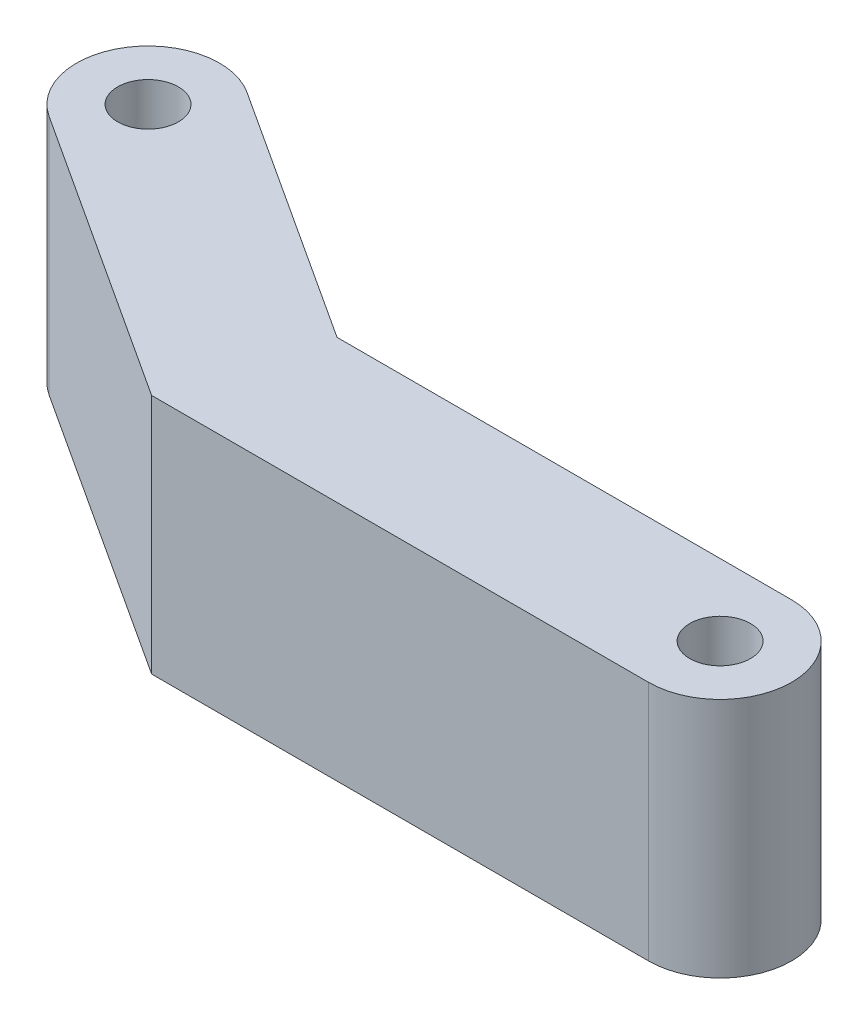
ISO-10303-21;
HEADER;
FILE_DESCRIPTION(('STEP AP214'),'2;1');
FILE_NAME('part.step','',(''),(''),'','','');
FILE_SCHEMA(('AUTOMOTIVE_DESIGN { 1 0 10303 214 1 1 1 1 }'));
ENDSEC;
DATA;
#1=APPLICATION_CONTEXT('core data for automotive mechanical design processes');
#2=APPLICATION_PROTOCOL_DEFINITION('international standard','automotive_design',2000,#1);
#3=PRODUCT_CONTEXT('',#1,'mechanical');
#4=PRODUCT('Part','Part','',(#3));
#5=PRODUCT_RELATED_PRODUCT_CATEGORY('part','',(#4));
#6=PRODUCT_DEFINITION_FORMATION('','',#4);
#7=PRODUCT_DEFINITION_CONTEXT('part definition',#1,'design');
#8=PRODUCT_DEFINITION('design','',#6,#7);
#9=PRODUCT_DEFINITION_SHAPE('','',#8);
#10=(LENGTH_UNIT() NAMED_UNIT(*) SI_UNIT(.MILLI.,.METRE.));
#11=(NAMED_UNIT(*) PLANE_ANGLE_UNIT() SI_UNIT($,.RADIAN.));
#12=(NAMED_UNIT(*) SI_UNIT($,.STERADIAN.) SOLID_ANGLE_UNIT());
#13=UNCERTAINTY_MEASURE_WITH_UNIT(LENGTH_MEASURE(1.E-05),#10,'distance_accuracy_value','');
#14=(GEOMETRIC_REPRESENTATION_CONTEXT(3) GLOBAL_UNCERTAINTY_ASSIGNED_CONTEXT((#13)) GLOBAL_UNIT_ASSIGNED_CONTEXT((#10,
#11,#12)) REPRESENTATION_CONTEXT('',''));
#15=CARTESIAN_POINT('',(0.,0.,0.));
#16=DIRECTION('',(0.,0.,1.));
#17=DIRECTION('',(1.,0.,0.));
#18=AXIS2_PLACEMENT_3D('',#15,#16,#17);
#19=CARTESIAN_POINT('',(-59.,-32.75,33.));
#20=DIRECTION('',(0.,1.,0.));
#21=DIRECTION('',(-1.,0.,0.));
#22=AXIS2_PLACEMENT_3D('',#19,#20,#21);
#23=PLANE('',#22);
#24=CARTESIAN_POINT('',(-101.,-32.75,19.));
#25=DIRECTION('',(0.,1.,0.));
#26=DIRECTION('',(0.,0.,1.));
#27=AXIS2_PLACEMENT_3D('',#24,#25,#26);
#28=CIRCLE('',#27,1.7);
#29=CARTESIAN_POINT('',(-101.,-32.75,20.7));
#30=VERTEX_POINT('',#29);
#31=EDGE_CURVE('E116',#30,#30,#28,.T.);
#32=ORIENTED_EDGE('',*,*,#31,.T.);
#33=EDGE_LOOP('',(#32));
#34=FACE_BOUND('',#33,.T.);
#35=CARTESIAN_POINT('',(-59.,-32.75,29.));
#36=DIRECTION('',(0.,1.,0.));
#37=DIRECTION('',(0.,0.,1.));
#38=AXIS2_PLACEMENT_3D('',#35,#36,#37);
#39=CIRCLE('',#38,1.7);
#40=CARTESIAN_POINT('',(-59.,-32.75,30.7));
#41=VERTEX_POINT('',#40);
#42=EDGE_CURVE('E82',#41,#41,#39,.T.);
#43=ORIENTED_EDGE('',*,*,#42,.T.);
#44=EDGE_LOOP('',(#43));
#45=FACE_BOUND('',#44,.T.);
#46=DIRECTION('',(0.838473833552322,0.,0.544941859695209));
#47=VECTOR('',#46,1.);
#48=CARTESIAN_POINT('',(-86.79915722741,-32.75,33.));
#49=LINE('',#48,#47);
#50=CARTESIAN_POINT('',(-103.179767478053,-32.75,22.3538953086832));
#51=VERTEX_POINT('',#50);
#52=CARTESIAN_POINT('',(-86.79915722741,-32.75,33.));
#53=VERTEX_POINT('',#52);
#54=EDGE_CURVE('E86',#51,#53,#49,.T.);
#55=ORIENTED_EDGE('',*,*,#54,.F.);
#56=CARTESIAN_POINT('',(-101.,-32.75,19.));
#57=DIRECTION('',(0.,1.,0.));
#58=DIRECTION('',(0.,0.,1.));
#59=AXIS2_PLACEMENT_3D('',#56,#57,#58);
#60=CIRCLE('',#59,4.);
#61=CARTESIAN_POINT('',(-98.8202326226737,-32.75,15.6461046258469));
#62=VERTEX_POINT('',#61);
#63=EDGE_CURVE('E120',#62,#51,#60,.T.);
#64=ORIENTED_EDGE('',*,*,#63,.F.);
#65=DIRECTION('',(0.838473833552322,0.,0.544941859695209));
#66=VECTOR('',#65,1.);
#67=CARTESIAN_POINT('',(-84.42787796414,-32.75,25.));
#68=LINE('',#67,#66);
#69=CARTESIAN_POINT('',(-84.42787796414,-32.75,25.));
#70=VERTEX_POINT('',#69);
#71=EDGE_CURVE('E98',#62,#70,#68,.T.);
#72=ORIENTED_EDGE('',*,*,#71,.T.);
#73=DIRECTION('',(1.,0.,0.));
#74=VECTOR('',#73,1.);
#75=CARTESIAN_POINT('',(-59.,-32.75,25.));
#76=LINE('',#75,#74);
#77=CARTESIAN_POINT('',(-59.,-32.75,25.));
#78=VERTEX_POINT('',#77);
#79=EDGE_CURVE('E72',#70,#78,#76,.T.);
#80=ORIENTED_EDGE('',*,*,#79,.T.);
#81=CARTESIAN_POINT('',(-59.,-32.75,29.));
#82=DIRECTION('',(0.,1.,0.));
#83=DIRECTION('',(0.,0.,1.));
#84=AXIS2_PLACEMENT_3D('',#81,#82,#83);
#85=CIRCLE('',#84,4.);
#86=CARTESIAN_POINT('',(-59.,-32.75,33.));
#87=VERTEX_POINT('',#86);
#88=EDGE_CURVE('E19',#87,#78,#85,.T.);
#89=ORIENTED_EDGE('',*,*,#88,.F.);
#90=DIRECTION('',(1.,0.,0.));
#91=VECTOR('',#90,1.);
#92=CARTESIAN_POINT('',(-59.,-32.75,33.));
#93=LINE('',#92,#91);
#94=EDGE_CURVE('E70',#53,#87,#93,.T.);
#95=ORIENTED_EDGE('',*,*,#94,.F.);
#96=EDGE_LOOP('',(#55,#64,#72,#80,#89,#95));
#97=FACE_BOUND('',#96,.T.);
#98=ADVANCED_FACE('F16',(#34,#45,#97),#23,.F.);
#99=CARTESIAN_POINT('',(-59.,-19.25,29.));
#100=DIRECTION('',(0.,1.,0.));
#101=DIRECTION('',(0.,0.,1.));
#102=AXIS2_PLACEMENT_3D('',#99,#100,#101);
#103=CYLINDRICAL_SURFACE('',#102,4.);
#104=DIRECTION('',(0.,-1.,0.));
#105=VECTOR('',#104,1.);
#106=CARTESIAN_POINT('',(-59.,-19.25,25.));
#107=LINE('',#106,#105);
#108=CARTESIAN_POINT('',(-59.,-19.25,25.));
#109=VERTEX_POINT('',#108);
#110=EDGE_CURVE('E90',#78,#109,#107,.F.);
#111=ORIENTED_EDGE('',*,*,#110,.T.);
#112=CARTESIAN_POINT('',(-59.,-19.25,29.));
#113=DIRECTION('',(0.,1.,0.));
#114=DIRECTION('',(0.,0.,1.));
#115=AXIS2_PLACEMENT_3D('',#112,#113,#114);
#116=CIRCLE('',#115,4.);
#117=CARTESIAN_POINT('',(-59.,-19.25,33.));
#118=VERTEX_POINT('',#117);
#119=EDGE_CURVE('E79',#118,#109,#116,.T.);
#120=ORIENTED_EDGE('',*,*,#119,.F.);
#121=DIRECTION('',(0.,-1.,0.));
#122=VECTOR('',#121,1.);
#123=CARTESIAN_POINT('',(-59.,-19.25,33.));
#124=LINE('',#123,#122);
#125=EDGE_CURVE('E76',#87,#118,#124,.F.);
#126=ORIENTED_EDGE('',*,*,#125,.F.);
#127=ORIENTED_EDGE('',*,*,#88,.T.);
#128=EDGE_LOOP('',(#111,#120,#126,#127));
#129=FACE_BOUND('',#128,.T.);
#130=ADVANCED_FACE('F77',(#129),#103,.T.);
#131=CARTESIAN_POINT('',(-59.,-19.25,25.));
#132=DIRECTION('',(0.,0.,1.));
#133=DIRECTION('',(0.,-1.,0.));
#134=AXIS2_PLACEMENT_3D('',#131,#132,#133);
#135=PLANE('',#134);
#136=ORIENTED_EDGE('',*,*,#79,.F.);
#137=DIRECTION('',(0.,1.,0.));
#138=VECTOR('',#137,1.);
#139=CARTESIAN_POINT('',(-84.42787796414,-19.25,25.));
#140=LINE('',#139,#138);
#141=CARTESIAN_POINT('',(-84.42787796414,-19.25,25.));
#142=VERTEX_POINT('',#141);
#143=EDGE_CURVE('E100',#70,#142,#140,.T.);
#144=ORIENTED_EDGE('',*,*,#143,.T.);
#145=DIRECTION('',(-1.,0.,0.));
#146=VECTOR('',#145,1.);
#147=CARTESIAN_POINT('',(-59.,-19.25,25.));
#148=LINE('',#147,#146);
#149=EDGE_CURVE('E115',#109,#142,#148,.T.);
#150=ORIENTED_EDGE('',*,*,#149,.F.);
#151=ORIENTED_EDGE('',*,*,#110,.F.);
#152=EDGE_LOOP('',(#136,#144,#150,#151));
#153=FACE_BOUND('',#152,.T.);
#154=ADVANCED_FACE('F158',(#153),#135,.F.);
#155=CARTESIAN_POINT('',(-84.42787796414,-19.25,25.));
#156=DIRECTION('',(-0.544941859695209,0.,0.838473833552322));
#157=DIRECTION('',(0.838473833552322,0.,0.544941859695209));
#158=AXIS2_PLACEMENT_3D('',#155,#156,#157);
#159=PLANE('',#158);
#160=ORIENTED_EDGE('',*,*,#71,.F.);
#161=DIRECTION('',(0.,1.,0.));
#162=VECTOR('',#161,1.);
#163=CARTESIAN_POINT('',(-98.8202326841311,-19.25,15.6461045859077));
#164=LINE('',#163,#162);
#165=CARTESIAN_POINT('',(-98.8202326226748,-19.25,15.6461046258483));
#166=VERTEX_POINT('',#165);
#167=EDGE_CURVE('E121',#166,#62,#164,.F.);
#168=ORIENTED_EDGE('',*,*,#167,.F.);
#169=DIRECTION('',(-0.838473833552373,0.,-0.544941859695131));
#170=VECTOR('',#169,1.);
#171=CARTESIAN_POINT('',(-84.42787796414,-19.25,25.));
#172=LINE('',#171,#170);
#173=EDGE_CURVE('E113',#142,#166,#172,.T.);
#174=ORIENTED_EDGE('',*,*,#173,.F.);
#175=ORIENTED_EDGE('',*,*,#143,.F.);
#176=EDGE_LOOP('',(#160,#168,#174,#175));
#177=FACE_BOUND('',#176,.T.);
#178=ADVANCED_FACE('F156',(#177),#159,.F.);
#179=CARTESIAN_POINT('',(-101.,-19.25,19.));
#180=DIRECTION('',(0.,1.,0.));
#181=DIRECTION('',(0.,0.,1.));
#182=AXIS2_PLACEMENT_3D('',#179,#180,#181);
#183=CYLINDRICAL_SURFACE('',#182,4.);
#184=DIRECTION('',(0.,1.,0.));
#185=VECTOR('',#184,1.);
#186=CARTESIAN_POINT('',(-103.179767517326,-19.25,22.3538952831589));
#187=LINE('',#186,#185);
#188=CARTESIAN_POINT('',(-103.179767478044,-19.25,22.3538953086607));
#189=VERTEX_POINT('',#188);
#190=EDGE_CURVE('E95',#189,#51,#187,.F.);
#191=ORIENTED_EDGE('',*,*,#190,.F.);
#192=CARTESIAN_POINT('',(-101.,-19.25,19.));
#193=DIRECTION('',(0.,1.,0.));
#194=DIRECTION('',(0.,0.,1.));
#195=AXIS2_PLACEMENT_3D('',#192,#193,#194);
#196=CIRCLE('',#195,4.);
#197=EDGE_CURVE('E109',#166,#189,#196,.T.);
#198=ORIENTED_EDGE('',*,*,#197,.F.);
#199=ORIENTED_EDGE('',*,*,#167,.T.);
#200=ORIENTED_EDGE('',*,*,#63,.T.);
#201=EDGE_LOOP('',(#191,#198,#199,#200));
#202=FACE_BOUND('',#201,.T.);
#203=ADVANCED_FACE('F151',(#202),#183,.T.);
#204=CARTESIAN_POINT('',(-86.79915722741,-19.25,33.));
#205=DIRECTION('',(-0.544941859695209,0.,0.838473833552322));
#206=DIRECTION('',(0.838473833552322,0.,0.544941859695209));
#207=AXIS2_PLACEMENT_3D('',#204,#205,#206);
#208=PLANE('',#207);
#209=ORIENTED_EDGE('',*,*,#54,.T.);
#210=DIRECTION('',(0.,-1.,0.));
#211=VECTOR('',#210,1.);
#212=CARTESIAN_POINT('',(-86.79915722741,-19.25,33.));
#213=LINE('',#212,#211);
#214=CARTESIAN_POINT('',(-86.79915722741,-19.25,33.));
#215=VERTEX_POINT('',#214);
#216=EDGE_CURVE('E34',#215,#53,#213,.T.);
#217=ORIENTED_EDGE('',*,*,#216,.F.);
#218=DIRECTION('',(0.838473833550996,0.,0.544941859697249));
#219=VECTOR('',#218,1.);
#220=CARTESIAN_POINT('',(-103.1797675173,-19.25,22.353895283119));
#221=LINE('',#220,#219);
#222=EDGE_CURVE('E112',#189,#215,#221,.T.);
#223=ORIENTED_EDGE('',*,*,#222,.F.);
#224=ORIENTED_EDGE('',*,*,#190,.T.);
#225=EDGE_LOOP('',(#209,#217,#223,#224));
#226=FACE_BOUND('',#225,.T.);
#227=ADVANCED_FACE('F150',(#226),#208,.T.);
#228=CARTESIAN_POINT('',(-59.,-19.25,33.));
#229=DIRECTION('',(0.,0.,1.));
#230=DIRECTION('',(0.,-1.,0.));
#231=AXIS2_PLACEMENT_3D('',#228,#229,#230);
#232=PLANE('',#231);
#233=ORIENTED_EDGE('',*,*,#94,.T.);
#234=ORIENTED_EDGE('',*,*,#125,.T.);
#235=DIRECTION('',(-1.,0.,0.));
#236=VECTOR('',#235,1.);
#237=CARTESIAN_POINT('',(-59.,-19.25,33.));
#238=LINE('',#237,#236);
#239=EDGE_CURVE('E108',#215,#118,#238,.F.);
#240=ORIENTED_EDGE('',*,*,#239,.F.);
#241=ORIENTED_EDGE('',*,*,#216,.T.);
#242=EDGE_LOOP('',(#233,#234,#240,#241));
#243=FACE_BOUND('',#242,.T.);
#244=ADVANCED_FACE('F84',(#243),#232,.T.);
#245=CARTESIAN_POINT('',(-59.,-19.25,29.));
#246=DIRECTION('',(0.,1.,0.));
#247=DIRECTION('',(0.,0.,1.));
#248=AXIS2_PLACEMENT_3D('',#245,#246,#247);
#249=CYLINDRICAL_SURFACE('',#248,1.7);
#250=ORIENTED_EDGE('',*,*,#42,.F.);
#251=EDGE_LOOP('',(#250));
#252=FACE_BOUND('',#251,.T.);
#253=CARTESIAN_POINT('',(-59.,-19.25,29.));
#254=DIRECTION('',(0.,1.,0.));
#255=DIRECTION('',(0.,0.,1.));
#256=AXIS2_PLACEMENT_3D('',#253,#254,#255);
#257=CIRCLE('',#256,1.7);
#258=CARTESIAN_POINT('',(-59.,-19.25,30.7));
#259=VERTEX_POINT('',#258);
#260=EDGE_CURVE('E25',#259,#259,#257,.F.);
#261=ORIENTED_EDGE('',*,*,#260,.F.);
#262=EDGE_LOOP('',(#261));
#263=FACE_BOUND('',#262,.T.);
#264=ADVANCED_FACE('F174',(#252,#263),#249,.F.);
#265=CARTESIAN_POINT('',(-101.,-19.25,19.));
#266=DIRECTION('',(0.,1.,0.));
#267=DIRECTION('',(0.,0.,1.));
#268=AXIS2_PLACEMENT_3D('',#265,#266,#267);
#269=CYLINDRICAL_SURFACE('',#268,1.7);
#270=ORIENTED_EDGE('',*,*,#31,.F.);
#271=EDGE_LOOP('',(#270));
#272=FACE_BOUND('',#271,.T.);
#273=CARTESIAN_POINT('',(-101.,-19.25,19.));
#274=DIRECTION('',(0.,1.,0.));
#275=DIRECTION('',(0.,0.,1.));
#276=AXIS2_PLACEMENT_3D('',#273,#274,#275);
#277=CIRCLE('',#276,1.7);
#278=CARTESIAN_POINT('',(-101.,-19.25,20.7));
#279=VERTEX_POINT('',#278);
#280=EDGE_CURVE('E10',#279,#279,#277,.F.);
#281=ORIENTED_EDGE('',*,*,#280,.F.);
#282=EDGE_LOOP('',(#281));
#283=FACE_BOUND('',#282,.T.);
#284=ADVANCED_FACE('F168',(#272,#283),#269,.F.);
#285=CARTESIAN_POINT('',(-59.,-19.25,33.));
#286=DIRECTION('',(0.,1.,0.));
#287=DIRECTION('',(-1.,0.,0.));
#288=AXIS2_PLACEMENT_3D('',#285,#286,#287);
#289=PLANE('',#288);
#290=ORIENTED_EDGE('',*,*,#280,.T.);
#291=EDGE_LOOP('',(#290));
#292=FACE_BOUND('',#291,.T.);
#293=ORIENTED_EDGE('',*,*,#260,.T.);
#294=EDGE_LOOP('',(#293));
#295=FACE_BOUND('',#294,.T.);
#296=ORIENTED_EDGE('',*,*,#222,.T.);
#297=ORIENTED_EDGE('',*,*,#239,.T.);
#298=ORIENTED_EDGE('',*,*,#119,.T.);
#299=ORIENTED_EDGE('',*,*,#149,.T.);
#300=ORIENTED_EDGE('',*,*,#173,.T.);
#301=ORIENTED_EDGE('',*,*,#197,.T.);
#302=EDGE_LOOP('',(#296,#297,#298,#299,#300,#301));
#303=FACE_BOUND('',#302,.T.);
#304=ADVANCED_FACE('F149',(#292,#295,#303),#289,.T.);
#305=CLOSED_SHELL('',(#98,#130,#154,#178,#203,#227,#244,#264,#284,#304));
#306=MANIFOLD_SOLID_BREP('B1',#305);
#307=ADVANCED_BREP_SHAPE_REPRESENTATION('',(#18,#306),#14);
#308=SHAPE_DEFINITION_REPRESENTATION(#9,#307);
ENDSEC;
END-ISO-10303-21;
